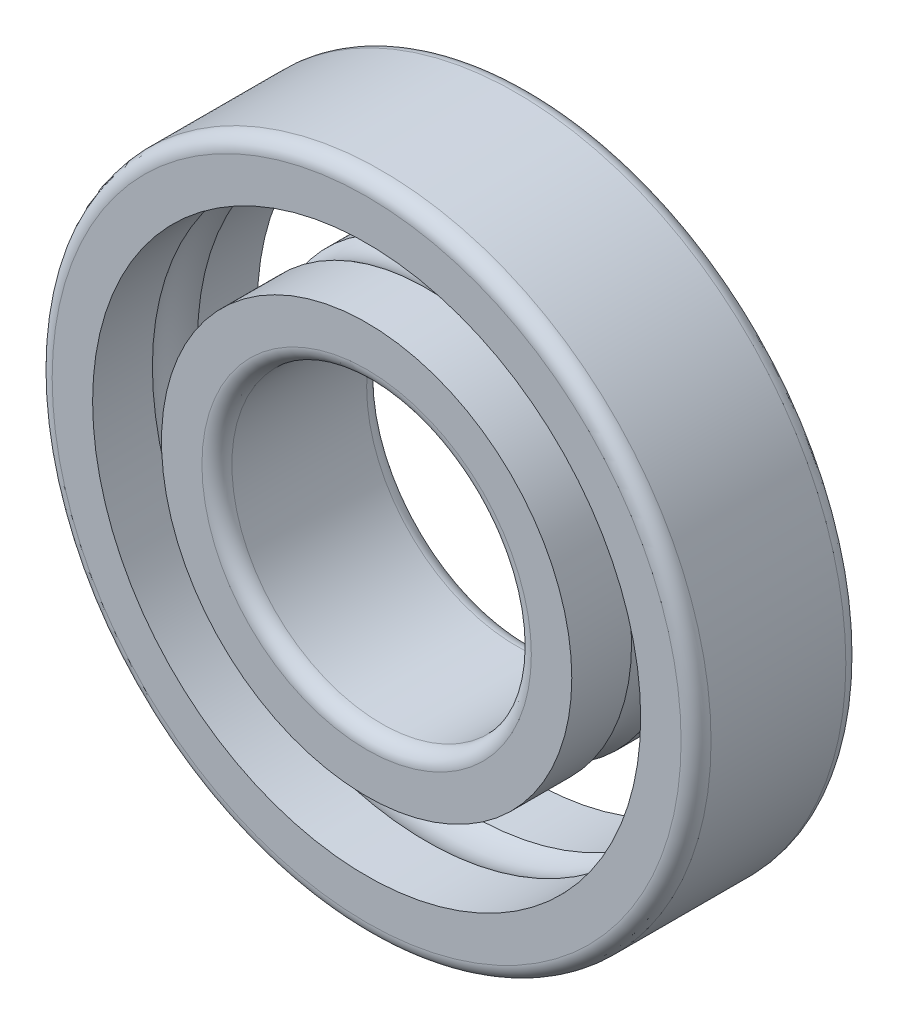
ISO-10303-21;
HEADER;
FILE_DESCRIPTION(('STEP AP214'),'2;1');
FILE_NAME('part.step','',(''),(''),'','','');
FILE_SCHEMA(('AUTOMOTIVE_DESIGN { 1 0 10303 214 1 1 1 1 }'));
ENDSEC;
DATA;
#1=APPLICATION_CONTEXT('core data for automotive mechanical design processes');
#2=APPLICATION_PROTOCOL_DEFINITION('international standard','automotive_design',2000,#1);
#3=PRODUCT_CONTEXT('',#1,'mechanical');
#4=PRODUCT('Part','Part','',(#3));
#5=PRODUCT_RELATED_PRODUCT_CATEGORY('part','',(#4));
#6=PRODUCT_DEFINITION_FORMATION('','',#4);
#7=PRODUCT_DEFINITION_CONTEXT('part definition',#1,'design');
#8=PRODUCT_DEFINITION('design','',#6,#7);
#9=PRODUCT_DEFINITION_SHAPE('','',#8);
#10=(LENGTH_UNIT() NAMED_UNIT(*) SI_UNIT(.MILLI.,.METRE.));
#11=(NAMED_UNIT(*) PLANE_ANGLE_UNIT() SI_UNIT($,.RADIAN.));
#12=(NAMED_UNIT(*) SI_UNIT($,.STERADIAN.) SOLID_ANGLE_UNIT());
#13=UNCERTAINTY_MEASURE_WITH_UNIT(LENGTH_MEASURE(1.E-05),#10,'distance_accuracy_value','');
#14=(GEOMETRIC_REPRESENTATION_CONTEXT(3) GLOBAL_UNCERTAINTY_ASSIGNED_CONTEXT((#13)) GLOBAL_UNIT_ASSIGNED_CONTEXT((#10,
#11,#12)) REPRESENTATION_CONTEXT('',''));
#15=CARTESIAN_POINT('',(0.,0.,0.));
#16=DIRECTION('',(0.,0.,1.));
#17=DIRECTION('',(1.,0.,0.));
#18=AXIS2_PLACEMENT_3D('',#15,#16,#17);
#19=CARTESIAN_POINT('',(0.,0.,14.2702044024532));
#20=DIRECTION('',(0.,0.,1.));
#21=DIRECTION('',(1.,0.,0.));
#22=AXIS2_PLACEMENT_3D('',#19,#20,#21);
#23=CYLINDRICAL_SURFACE('',#22,10.);
#24=CARTESIAN_POINT('',(0.,0.,-5.));
#25=DIRECTION('',(0.,0.,-1.));
#26=DIRECTION('',(-1.,0.,0.));
#27=AXIS2_PLACEMENT_3D('',#24,#25,#26);
#28=CIRCLE('',#27,10.);
#29=CARTESIAN_POINT('',(-10.,0.,-5.));
#30=VERTEX_POINT('',#29);
#31=EDGE_CURVE('E51',#30,#30,#28,.T.);
#32=ORIENTED_EDGE('',*,*,#31,.T.);
#33=EDGE_LOOP('',(#32));
#34=FACE_BOUND('',#33,.T.);
#35=CARTESIAN_POINT('',(0.,0.,4.));
#36=DIRECTION('',(0.,0.,1.));
#37=DIRECTION('',(1.,0.,0.));
#38=AXIS2_PLACEMENT_3D('',#35,#36,#37);
#39=CIRCLE('',#38,10.);
#40=CARTESIAN_POINT('',(10.,0.,4.));
#41=VERTEX_POINT('',#40);
#42=EDGE_CURVE('E55',#41,#41,#39,.T.);
#43=ORIENTED_EDGE('',*,*,#42,.T.);
#44=EDGE_LOOP('',(#43));
#45=FACE_BOUND('',#44,.T.);
#46=ADVANCED_FACE('F44',(#34,#45),#23,.F.);
#47=CARTESIAN_POINT('',(10.,0.,5.));
#48=DIRECTION('',(0.,0.,1.));
#49=DIRECTION('',(1.,0.,0.));
#50=AXIS2_PLACEMENT_3D('',#47,#48,#49);
#51=PLANE('',#50);
#52=CARTESIAN_POINT('',(0.,0.,5.));
#53=DIRECTION('',(0.,0.,1.));
#54=DIRECTION('',(1.,0.,0.));
#55=AXIS2_PLACEMENT_3D('',#52,#53,#54);
#56=CIRCLE('',#55,11.);
#57=CARTESIAN_POINT('',(11.,0.,5.));
#58=VERTEX_POINT('',#57);
#59=EDGE_CURVE('E11',#58,#58,#56,.F.);
#60=ORIENTED_EDGE('',*,*,#59,.T.);
#61=EDGE_LOOP('',(#60));
#62=FACE_BOUND('',#61,.T.);
#63=CARTESIAN_POINT('',(0.,0.,5.));
#64=DIRECTION('',(0.,0.,1.));
#65=DIRECTION('',(1.,0.,0.));
#66=AXIS2_PLACEMENT_3D('',#63,#64,#65);
#67=CIRCLE('',#66,13.7);
#68=CARTESIAN_POINT('',(13.7,0.,5.));
#69=VERTEX_POINT('',#68);
#70=EDGE_CURVE('E64',#69,#69,#67,.T.);
#71=ORIENTED_EDGE('',*,*,#70,.T.);
#72=EDGE_LOOP('',(#71));
#73=FACE_BOUND('',#72,.T.);
#74=ADVANCED_FACE('F95',(#62,#73),#51,.T.);
#75=CARTESIAN_POINT('',(0.,0.,14.2702044024532));
#76=DIRECTION('',(0.,0.,1.));
#77=DIRECTION('',(1.,0.,0.));
#78=AXIS2_PLACEMENT_3D('',#75,#76,#77);
#79=CYLINDRICAL_SURFACE('',#78,13.7);
#80=CARTESIAN_POINT('',(0.,0.,1.00748134316814));
#81=DIRECTION('',(0.,0.,1.));
#82=DIRECTION('',(1.,0.,0.));
#83=AXIS2_PLACEMENT_3D('',#80,#81,#82);
#84=CIRCLE('',#83,13.7);
#85=CARTESIAN_POINT('',(13.7,0.,1.00748134316814));
#86=VERTEX_POINT('',#85);
#87=EDGE_CURVE('E67',#86,#86,#84,.T.);
#88=ORIENTED_EDGE('',*,*,#87,.T.);
#89=EDGE_LOOP('',(#88));
#90=FACE_BOUND('',#89,.T.);
#91=ORIENTED_EDGE('',*,*,#70,.F.);
#92=EDGE_LOOP('',(#91));
#93=FACE_BOUND('',#92,.T.);
#94=ADVANCED_FACE('F100',(#90,#93),#79,.T.);
#95=CARTESIAN_POINT('',(0.,0.,-0.499999999999996));
#96=DIRECTION('',(0.,0.,1.));
#97=DIRECTION('',(1.,0.,0.));
#98=AXIS2_PLACEMENT_3D('',#95,#96,#97);
#99=TOROIDAL_SURFACE('',#98,16.,2.75);
#100=CARTESIAN_POINT('',(0.,0.,-2.00748134316813));
#101=DIRECTION('',(0.,0.,1.));
#102=DIRECTION('',(1.,0.,0.));
#103=AXIS2_PLACEMENT_3D('',#100,#101,#102);
#104=CIRCLE('',#103,13.7);
#105=CARTESIAN_POINT('',(13.7,0.,-2.00748134316813));
#106=VERTEX_POINT('',#105);
#107=EDGE_CURVE('E70',#106,#106,#104,.T.);
#108=ORIENTED_EDGE('',*,*,#107,.T.);
#109=EDGE_LOOP('',(#108));
#110=FACE_BOUND('',#109,.T.);
#111=ORIENTED_EDGE('',*,*,#87,.F.);
#112=EDGE_LOOP('',(#111));
#113=FACE_BOUND('',#112,.T.);
#114=ADVANCED_FACE('F92',(#110,#113),#99,.F.);
#115=CARTESIAN_POINT('',(0.,0.,14.2702044024532));
#116=DIRECTION('',(0.,0.,1.));
#117=DIRECTION('',(1.,0.,0.));
#118=AXIS2_PLACEMENT_3D('',#115,#116,#117);
#119=CYLINDRICAL_SURFACE('',#118,13.7);
#120=CARTESIAN_POINT('',(0.,0.,-6.));
#121=DIRECTION('',(0.,0.,1.));
#122=DIRECTION('',(1.,0.,0.));
#123=AXIS2_PLACEMENT_3D('',#120,#121,#122);
#124=CIRCLE('',#123,13.7);
#125=CARTESIAN_POINT('',(13.7,0.,-6.));
#126=VERTEX_POINT('',#125);
#127=EDGE_CURVE('E73',#126,#126,#124,.T.);
#128=ORIENTED_EDGE('',*,*,#127,.T.);
#129=EDGE_LOOP('',(#128));
#130=FACE_BOUND('',#129,.T.);
#131=ORIENTED_EDGE('',*,*,#107,.F.);
#132=EDGE_LOOP('',(#131));
#133=FACE_BOUND('',#132,.T.);
#134=ADVANCED_FACE('F77',(#130,#133),#119,.T.);
#135=CARTESIAN_POINT('',(10.,0.,-6.));
#136=DIRECTION('',(0.,0.,-1.));
#137=DIRECTION('',(-1.,0.,0.));
#138=AXIS2_PLACEMENT_3D('',#135,#136,#137);
#139=PLANE('',#138);
#140=CARTESIAN_POINT('',(0.,0.,-6.));
#141=DIRECTION('',(0.,0.,-1.));
#142=DIRECTION('',(-1.,0.,0.));
#143=AXIS2_PLACEMENT_3D('',#140,#141,#142);
#144=CIRCLE('',#143,11.);
#145=CARTESIAN_POINT('',(-11.,0.,-6.));
#146=VERTEX_POINT('',#145);
#147=EDGE_CURVE('E59',#146,#146,#144,.F.);
#148=ORIENTED_EDGE('',*,*,#147,.T.);
#149=EDGE_LOOP('',(#148));
#150=FACE_BOUND('',#149,.T.);
#151=ORIENTED_EDGE('',*,*,#127,.F.);
#152=EDGE_LOOP('',(#151));
#153=FACE_BOUND('',#152,.T.);
#154=ADVANCED_FACE('F80',(#150,#153),#139,.T.);
#155=CARTESIAN_POINT('',(0.,0.,-5.));
#156=DIRECTION('',(0.,0.,-1.));
#157=DIRECTION('',(-1.,0.,0.));
#158=AXIS2_PLACEMENT_3D('',#155,#156,#157);
#159=TOROIDAL_SURFACE('',#158,11.,1.);
#160=ORIENTED_EDGE('',*,*,#31,.F.);
#161=EDGE_LOOP('',(#160));
#162=FACE_BOUND('',#161,.T.);
#163=ORIENTED_EDGE('',*,*,#147,.F.);
#164=EDGE_LOOP('',(#163));
#165=FACE_BOUND('',#164,.T.);
#166=ADVANCED_FACE('F82',(#162,#165),#159,.T.);
#167=CARTESIAN_POINT('',(0.,0.,4.));
#168=DIRECTION('',(0.,0.,1.));
#169=DIRECTION('',(1.,0.,0.));
#170=AXIS2_PLACEMENT_3D('',#167,#168,#169);
#171=TOROIDAL_SURFACE('',#170,11.,1.);
#172=ORIENTED_EDGE('',*,*,#59,.F.);
#173=EDGE_LOOP('',(#172));
#174=FACE_BOUND('',#173,.T.);
#175=ORIENTED_EDGE('',*,*,#42,.F.);
#176=EDGE_LOOP('',(#175));
#177=FACE_BOUND('',#176,.T.);
#178=ADVANCED_FACE('F46',(#174,#177),#171,.T.);
#179=CLOSED_SHELL('',(#46,#74,#94,#114,#134,#154,#166,#178));
#180=MANIFOLD_SOLID_BREP('B2',#179);
#181=CARTESIAN_POINT('',(18.3,0.,5.));
#182=DIRECTION('',(0.,0.,1.));
#183=DIRECTION('',(1.,0.,0.));
#184=AXIS2_PLACEMENT_3D('',#181,#182,#183);
#185=PLANE('',#184);
#186=CARTESIAN_POINT('',(0.,0.,5.));
#187=DIRECTION('',(0.,0.,1.));
#188=DIRECTION('',(1.,0.,0.));
#189=AXIS2_PLACEMENT_3D('',#186,#187,#188);
#190=CIRCLE('',#189,21.);
#191=CARTESIAN_POINT('',(21.,0.,5.));
#192=VERTEX_POINT('',#191);
#193=EDGE_CURVE('E43',#192,#192,#190,.T.);
#194=ORIENTED_EDGE('',*,*,#193,.T.);
#195=EDGE_LOOP('',(#194));
#196=FACE_BOUND('',#195,.T.);
#197=CARTESIAN_POINT('',(0.,0.,5.));
#198=DIRECTION('',(0.,0.,1.));
#199=DIRECTION('',(1.,0.,0.));
#200=AXIS2_PLACEMENT_3D('',#197,#198,#199);
#201=CIRCLE('',#200,18.3);
#202=CARTESIAN_POINT('',(18.3,0.,5.));
#203=VERTEX_POINT('',#202);
#204=EDGE_CURVE('E194',#203,#203,#201,.T.);
#205=ORIENTED_EDGE('',*,*,#204,.F.);
#206=EDGE_LOOP('',(#205));
#207=FACE_BOUND('',#206,.T.);
#208=ADVANCED_FACE('F165',(#196,#207),#185,.T.);
#209=CARTESIAN_POINT('',(0.,0.,14.2702044024532));
#210=DIRECTION('',(0.,0.,1.));
#211=DIRECTION('',(1.,0.,0.));
#212=AXIS2_PLACEMENT_3D('',#209,#210,#211);
#213=CYLINDRICAL_SURFACE('',#212,22.);
#214=CARTESIAN_POINT('',(0.,0.,-5.));
#215=DIRECTION('',(0.,0.,-1.));
#216=DIRECTION('',(-1.,0.,0.));
#217=AXIS2_PLACEMENT_3D('',#214,#215,#216);
#218=CIRCLE('',#217,22.);
#219=CARTESIAN_POINT('',(-22.,0.,-5.));
#220=VERTEX_POINT('',#219);
#221=EDGE_CURVE('E176',#220,#220,#218,.F.);
#222=ORIENTED_EDGE('',*,*,#221,.T.);
#223=EDGE_LOOP('',(#222));
#224=FACE_BOUND('',#223,.T.);
#225=CARTESIAN_POINT('',(0.,0.,4.));
#226=DIRECTION('',(0.,0.,1.));
#227=DIRECTION('',(1.,0.,0.));
#228=AXIS2_PLACEMENT_3D('',#225,#226,#227);
#229=CIRCLE('',#228,22.);
#230=CARTESIAN_POINT('',(22.,0.,4.));
#231=VERTEX_POINT('',#230);
#232=EDGE_CURVE('E180',#231,#231,#229,.F.);
#233=ORIENTED_EDGE('',*,*,#232,.T.);
#234=EDGE_LOOP('',(#233));
#235=FACE_BOUND('',#234,.T.);
#236=ADVANCED_FACE('F202',(#224,#235),#213,.T.);
#237=CARTESIAN_POINT('',(18.3,0.,-6.));
#238=DIRECTION('',(0.,0.,-1.));
#239=DIRECTION('',(-1.,0.,0.));
#240=AXIS2_PLACEMENT_3D('',#237,#238,#239);
#241=PLANE('',#240);
#242=CARTESIAN_POINT('',(0.,0.,-6.));
#243=DIRECTION('',(0.,0.,-1.));
#244=DIRECTION('',(-1.,0.,0.));
#245=AXIS2_PLACEMENT_3D('',#242,#243,#244);
#246=CIRCLE('',#245,21.);
#247=CARTESIAN_POINT('',(-21.,0.,-6.));
#248=VERTEX_POINT('',#247);
#249=EDGE_CURVE('E172',#248,#248,#246,.T.);
#250=ORIENTED_EDGE('',*,*,#249,.T.);
#251=EDGE_LOOP('',(#250));
#252=FACE_BOUND('',#251,.T.);
#253=CARTESIAN_POINT('',(0.,0.,-6.));
#254=DIRECTION('',(0.,0.,1.));
#255=DIRECTION('',(1.,0.,0.));
#256=AXIS2_PLACEMENT_3D('',#253,#254,#255);
#257=CIRCLE('',#256,18.3);
#258=CARTESIAN_POINT('',(18.3,0.,-6.));
#259=VERTEX_POINT('',#258);
#260=EDGE_CURVE('E185',#259,#259,#257,.T.);
#261=ORIENTED_EDGE('',*,*,#260,.T.);
#262=EDGE_LOOP('',(#261));
#263=FACE_BOUND('',#262,.T.);
#264=ADVANCED_FACE('F208',(#252,#263),#241,.T.);
#265=CARTESIAN_POINT('',(0.,0.,14.2702044024532));
#266=DIRECTION('',(0.,0.,1.));
#267=DIRECTION('',(1.,0.,0.));
#268=AXIS2_PLACEMENT_3D('',#265,#266,#267);
#269=CYLINDRICAL_SURFACE('',#268,18.3);
#270=CARTESIAN_POINT('',(0.,0.,-2.00748134316812));
#271=DIRECTION('',(0.,0.,1.));
#272=DIRECTION('',(1.,0.,0.));
#273=AXIS2_PLACEMENT_3D('',#270,#271,#272);
#274=CIRCLE('',#273,18.3);
#275=CARTESIAN_POINT('',(18.3,0.,-2.00748134316812));
#276=VERTEX_POINT('',#275);
#277=EDGE_CURVE('E188',#276,#276,#274,.T.);
#278=ORIENTED_EDGE('',*,*,#277,.T.);
#279=EDGE_LOOP('',(#278));
#280=FACE_BOUND('',#279,.T.);
#281=ORIENTED_EDGE('',*,*,#260,.F.);
#282=EDGE_LOOP('',(#281));
#283=FACE_BOUND('',#282,.T.);
#284=ADVANCED_FACE('F229',(#280,#283),#269,.F.);
#285=CARTESIAN_POINT('',(0.,0.,-0.499999999999996));
#286=DIRECTION('',(0.,0.,1.));
#287=DIRECTION('',(1.,0.,0.));
#288=AXIS2_PLACEMENT_3D('',#285,#286,#287);
#289=TOROIDAL_SURFACE('',#288,16.,2.75);
#290=CARTESIAN_POINT('',(0.,0.,1.00748134316813));
#291=DIRECTION('',(0.,0.,1.));
#292=DIRECTION('',(1.,0.,0.));
#293=AXIS2_PLACEMENT_3D('',#290,#291,#292);
#294=CIRCLE('',#293,18.3);
#295=CARTESIAN_POINT('',(18.3,0.,1.00748134316813));
#296=VERTEX_POINT('',#295);
#297=EDGE_CURVE('E191',#296,#296,#294,.T.);
#298=ORIENTED_EDGE('',*,*,#297,.T.);
#299=EDGE_LOOP('',(#298));
#300=FACE_BOUND('',#299,.T.);
#301=ORIENTED_EDGE('',*,*,#277,.F.);
#302=EDGE_LOOP('',(#301));
#303=FACE_BOUND('',#302,.T.);
#304=ADVANCED_FACE('F220',(#300,#303),#289,.F.);
#305=CARTESIAN_POINT('',(0.,0.,14.2702044024532));
#306=DIRECTION('',(0.,0.,1.));
#307=DIRECTION('',(1.,0.,0.));
#308=AXIS2_PLACEMENT_3D('',#305,#306,#307);
#309=CYLINDRICAL_SURFACE('',#308,18.3);
#310=ORIENTED_EDGE('',*,*,#204,.T.);
#311=EDGE_LOOP('',(#310));
#312=FACE_BOUND('',#311,.T.);
#313=ORIENTED_EDGE('',*,*,#297,.F.);
#314=EDGE_LOOP('',(#313));
#315=FACE_BOUND('',#314,.T.);
#316=ADVANCED_FACE('F198',(#312,#315),#309,.F.);
#317=CARTESIAN_POINT('',(0.,0.,-5.));
#318=DIRECTION('',(0.,0.,-1.));
#319=DIRECTION('',(-1.,0.,0.));
#320=AXIS2_PLACEMENT_3D('',#317,#318,#319);
#321=TOROIDAL_SURFACE('',#320,21.,1.);
#322=ORIENTED_EDGE('',*,*,#249,.F.);
#323=EDGE_LOOP('',(#322));
#324=FACE_BOUND('',#323,.T.);
#325=ORIENTED_EDGE('',*,*,#221,.F.);
#326=EDGE_LOOP('',(#325));
#327=FACE_BOUND('',#326,.T.);
#328=ADVANCED_FACE('F212',(#324,#327),#321,.T.);
#329=CARTESIAN_POINT('',(0.,0.,4.));
#330=DIRECTION('',(0.,0.,1.));
#331=DIRECTION('',(1.,0.,0.));
#332=AXIS2_PLACEMENT_3D('',#329,#330,#331);
#333=TOROIDAL_SURFACE('',#332,21.,1.);
#334=ORIENTED_EDGE('',*,*,#232,.F.);
#335=EDGE_LOOP('',(#334));
#336=FACE_BOUND('',#335,.T.);
#337=ORIENTED_EDGE('',*,*,#193,.F.);
#338=EDGE_LOOP('',(#337));
#339=FACE_BOUND('',#338,.T.);
#340=ADVANCED_FACE('F167',(#336,#339),#333,.T.);
#341=CLOSED_SHELL('',(#208,#236,#264,#284,#304,#316,#328,#340));
#342=MANIFOLD_SOLID_BREP('B6',#341);
#343=ADVANCED_BREP_SHAPE_REPRESENTATION('',(#18,#180,#342),#14);
#344=SHAPE_DEFINITION_REPRESENTATION(#9,#343);
ENDSEC;
END-ISO-10303-21;
